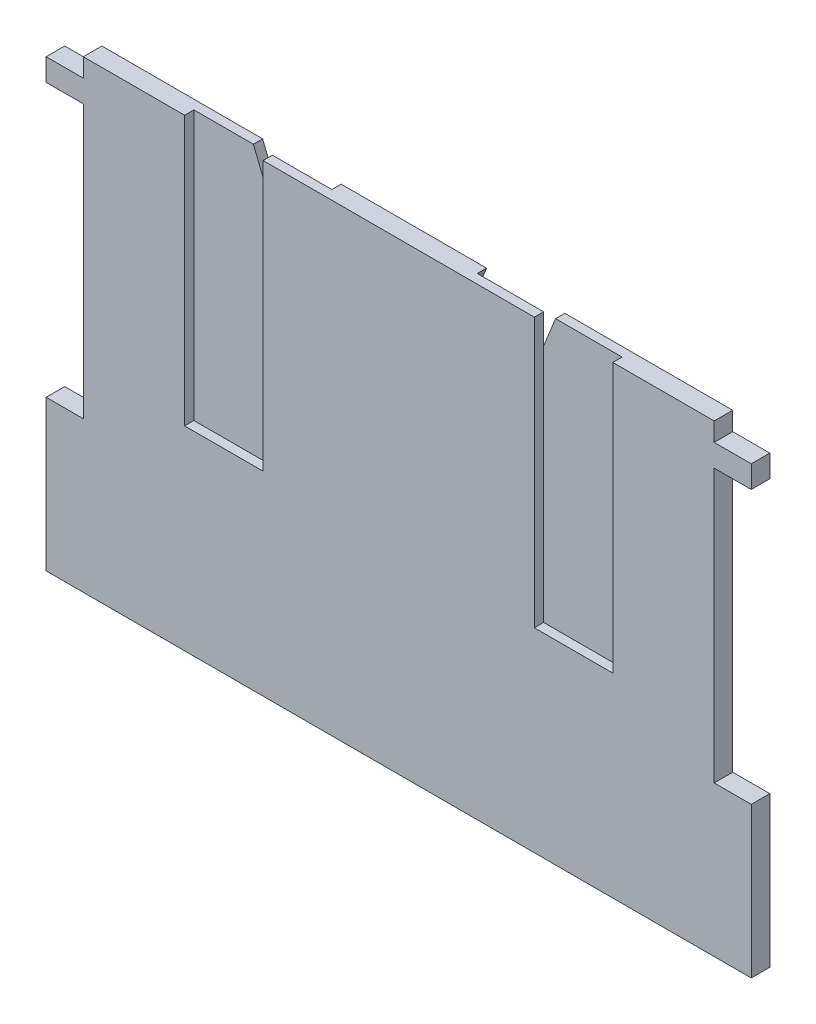
ISO-10303-21;
HEADER;
FILE_DESCRIPTION(('STEP AP214'),'2;1');
FILE_NAME('part.step','',(''),(''),'','','');
FILE_SCHEMA(('AUTOMOTIVE_DESIGN { 1 0 10303 214 1 1 1 1 }'));
ENDSEC;
DATA;
#1=APPLICATION_CONTEXT('core data for automotive mechanical design processes');
#2=APPLICATION_PROTOCOL_DEFINITION('international standard','automotive_design',2000,#1);
#3=PRODUCT_CONTEXT('',#1,'mechanical');
#4=PRODUCT('Part','Part','',(#3));
#5=PRODUCT_RELATED_PRODUCT_CATEGORY('part','',(#4));
#6=PRODUCT_DEFINITION_FORMATION('','',#4);
#7=PRODUCT_DEFINITION_CONTEXT('part definition',#1,'design');
#8=PRODUCT_DEFINITION('design','',#6,#7);
#9=PRODUCT_DEFINITION_SHAPE('','',#8);
#10=(LENGTH_UNIT() NAMED_UNIT(*) SI_UNIT(.MILLI.,.METRE.));
#11=(NAMED_UNIT(*) PLANE_ANGLE_UNIT() SI_UNIT($,.RADIAN.));
#12=(NAMED_UNIT(*) SI_UNIT($,.STERADIAN.) SOLID_ANGLE_UNIT());
#13=UNCERTAINTY_MEASURE_WITH_UNIT(LENGTH_MEASURE(1.E-05),#10,'distance_accuracy_value','');
#14=(GEOMETRIC_REPRESENTATION_CONTEXT(3) GLOBAL_UNCERTAINTY_ASSIGNED_CONTEXT((#13)) GLOBAL_UNIT_ASSIGNED_CONTEXT((#10,
#11,#12)) REPRESENTATION_CONTEXT('',''));
#15=CARTESIAN_POINT('',(0.,0.,0.));
#16=DIRECTION('',(0.,0.,1.));
#17=DIRECTION('',(1.,0.,0.));
#18=AXIS2_PLACEMENT_3D('',#15,#16,#17);
#19=CARTESIAN_POINT('',(-17.,-0.5,1.));
#20=DIRECTION('',(0.,-1.,0.));
#21=DIRECTION('',(0.,0.,-1.));
#22=AXIS2_PLACEMENT_3D('',#19,#20,#21);
#23=PLANE('',#22);
#24=DIRECTION('',(0.,0.,-1.));
#25=VECTOR('',#24,1.);
#26=CARTESIAN_POINT('',(-7.30769230769334,-0.5,1.));
#27=LINE('',#26,#25);
#28=CARTESIAN_POINT('',(-7.30769230769334,-0.5,1.));
#29=VERTEX_POINT('',#28);
#30=CARTESIAN_POINT('',(-7.30769230769334,-0.5,0.5));
#31=VERTEX_POINT('',#30);
#32=EDGE_CURVE('E283',#29,#31,#27,.T.);
#33=ORIENTED_EDGE('',*,*,#32,.F.);
#34=DIRECTION('',(-1.,0.,0.));
#35=VECTOR('',#34,1.);
#36=CARTESIAN_POINT('',(-17.,-0.5,1.));
#37=LINE('',#36,#35);
#38=CARTESIAN_POINT('',(7.30769230769127,-0.5,1.));
#39=VERTEX_POINT('',#38);
#40=EDGE_CURVE('E487',#39,#29,#37,.T.);
#41=ORIENTED_EDGE('',*,*,#40,.F.);
#42=DIRECTION('',(0.,0.,1.));
#43=VECTOR('',#42,1.);
#44=CARTESIAN_POINT('',(7.30769230769127,-0.5,1.));
#45=LINE('',#44,#43);
#46=CARTESIAN_POINT('',(7.30769230769127,-0.5,0.5));
#47=VERTEX_POINT('',#46);
#48=EDGE_CURVE('E285',#47,#39,#45,.T.);
#49=ORIENTED_EDGE('',*,*,#48,.F.);
#50=DIRECTION('',(1.,0.,0.));
#51=VECTOR('',#50,1.);
#52=CARTESIAN_POINT('',(-17.,-0.5,0.5));
#53=LINE('',#52,#51);
#54=CARTESIAN_POINT('',(3.73248914305372,-0.500000000000001,0.5));
#55=VERTEX_POINT('',#54);
#56=EDGE_CURVE('E491',#55,#47,#53,.T.);
#57=ORIENTED_EDGE('',*,*,#56,.F.);
#58=DIRECTION('',(0.,0.,1.));
#59=VECTOR('',#58,1.);
#60=CARTESIAN_POINT('',(3.73248914305372,-0.5,1.));
#61=LINE('',#60,#59);
#62=CARTESIAN_POINT('',(3.73248914305372,-0.500000000000001,0.));
#63=VERTEX_POINT('',#62);
#64=EDGE_CURVE('E492',#63,#55,#61,.T.);
#65=ORIENTED_EDGE('',*,*,#64,.F.);
#66=DIRECTION('',(1.,0.,0.));
#67=VECTOR('',#66,1.);
#68=CARTESIAN_POINT('',(-17.,-0.5,0.));
#69=LINE('',#68,#67);
#70=CARTESIAN_POINT('',(-4.10410844046952,-0.500000000000001,0.));
#71=VERTEX_POINT('',#70);
#72=EDGE_CURVE('E558',#63,#71,#69,.F.);
#73=ORIENTED_EDGE('',*,*,#72,.T.);
#74=DIRECTION('',(0.,0.,-1.));
#75=VECTOR('',#74,1.);
#76=CARTESIAN_POINT('',(-4.10410844046952,-0.5,1.));
#77=LINE('',#76,#75);
#78=CARTESIAN_POINT('',(-4.10410844046952,-0.5,0.5));
#79=VERTEX_POINT('',#78);
#80=EDGE_CURVE('E547',#79,#71,#77,.T.);
#81=ORIENTED_EDGE('',*,*,#80,.F.);
#82=EDGE_CURVE('E496',#31,#79,#53,.T.);
#83=ORIENTED_EDGE('',*,*,#82,.F.);
#84=EDGE_LOOP('',(#33,#41,#49,#57,#65,#73,#81,#83));
#85=FACE_BOUND('',#84,.T.);
#86=ADVANCED_FACE('F39',(#85),#23,.F.);
#87=DIRECTION('',(0.,0.,-1.));
#88=VECTOR('',#87,1.);
#89=CARTESIAN_POINT('',(11.5384615384605,-0.5,1.));
#90=LINE('',#89,#88);
#91=CARTESIAN_POINT('',(11.5384615384605,-0.5,1.));
#92=VERTEX_POINT('',#91);
#93=CARTESIAN_POINT('',(11.5384615384605,-0.5,0.5));
#94=VERTEX_POINT('',#93);
#95=EDGE_CURVE('E11',#92,#94,#90,.T.);
#96=ORIENTED_EDGE('',*,*,#95,.F.);
#97=CARTESIAN_POINT('',(17.,-0.5,1.));
#98=VERTEX_POINT('',#97);
#99=EDGE_CURVE('E488',#98,#92,#37,.T.);
#100=ORIENTED_EDGE('',*,*,#99,.F.);
#101=DIRECTION('',(0.,0.,-1.));
#102=VECTOR('',#101,1.);
#103=CARTESIAN_POINT('',(17.,-0.5,1.));
#104=LINE('',#103,#102);
#105=CARTESIAN_POINT('',(17.,-0.5,0.));
#106=VERTEX_POINT('',#105);
#107=EDGE_CURVE('E460',#98,#106,#104,.T.);
#108=ORIENTED_EDGE('',*,*,#107,.T.);
#109=DIRECTION('',(1.,0.,0.));
#110=VECTOR('',#109,1.);
#111=CARTESIAN_POINT('',(-17.,-0.5,0.));
#112=LINE('',#111,#110);
#113=CARTESIAN_POINT('',(7.95042067307694,-0.500000000000002,0.));
#114=VERTEX_POINT('',#113);
#115=EDGE_CURVE('E544',#106,#114,#112,.F.);
#116=ORIENTED_EDGE('',*,*,#115,.T.);
#117=DIRECTION('',(0.,0.,-1.));
#118=VECTOR('',#117,1.);
#119=CARTESIAN_POINT('',(7.95042067307694,-0.5,1.));
#120=LINE('',#119,#118);
#121=CARTESIAN_POINT('',(7.95042067307694,-0.5,0.500000000000537));
#122=VERTEX_POINT('',#121);
#123=EDGE_CURVE('E550',#122,#114,#120,.T.);
#124=ORIENTED_EDGE('',*,*,#123,.F.);
#125=DIRECTION('',(-1.,0.,0.));
#126=VECTOR('',#125,1.);
#127=CARTESIAN_POINT('',(-17.,-0.5,0.49999999999977));
#128=LINE('',#127,#126);
#129=EDGE_CURVE('E294',#94,#122,#128,.T.);
#130=ORIENTED_EDGE('',*,*,#129,.F.);
#131=EDGE_LOOP('',(#96,#100,#108,#116,#124,#130));
#132=FACE_BOUND('',#131,.T.);
#133=ADVANCED_FACE('F344',(#132),#23,.F.);
#134=DIRECTION('',(0.,0.,1.));
#135=VECTOR('',#134,1.);
#136=CARTESIAN_POINT('',(-11.5384615384626,-0.5,1.));
#137=LINE('',#136,#135);
#138=CARTESIAN_POINT('',(-11.5384615384626,-0.5,0.5));
#139=VERTEX_POINT('',#138);
#140=CARTESIAN_POINT('',(-11.5384615384626,-0.5,1.));
#141=VERTEX_POINT('',#140);
#142=EDGE_CURVE('E50',#139,#141,#137,.T.);
#143=ORIENTED_EDGE('',*,*,#142,.F.);
#144=CARTESIAN_POINT('',(-8.33193108974358,-0.5,0.500000000000036));
#145=VERTEX_POINT('',#144);
#146=EDGE_CURVE('E295',#145,#139,#128,.T.);
#147=ORIENTED_EDGE('',*,*,#146,.F.);
#148=DIRECTION('',(0.,0.,1.));
#149=VECTOR('',#148,1.);
#150=CARTESIAN_POINT('',(-8.33193108974357,-0.5,1.));
#151=LINE('',#150,#149);
#152=CARTESIAN_POINT('',(-8.33193108974358,-0.5,0.));
#153=VERTEX_POINT('',#152);
#154=EDGE_CURVE('E549',#153,#145,#151,.T.);
#155=ORIENTED_EDGE('',*,*,#154,.F.);
#156=DIRECTION('',(1.,0.,0.));
#157=VECTOR('',#156,1.);
#158=CARTESIAN_POINT('',(-17.,-0.5,0.));
#159=LINE('',#158,#157);
#160=CARTESIAN_POINT('',(-17.,-0.5,0.));
#161=VERTEX_POINT('',#160);
#162=EDGE_CURVE('E565',#153,#161,#159,.F.);
#163=ORIENTED_EDGE('',*,*,#162,.T.);
#164=DIRECTION('',(0.,0.,-1.));
#165=VECTOR('',#164,1.);
#166=CARTESIAN_POINT('',(-17.,-0.5,1.));
#167=LINE('',#166,#165);
#168=CARTESIAN_POINT('',(-17.,-0.5,1.));
#169=VERTEX_POINT('',#168);
#170=EDGE_CURVE('E453',#169,#161,#167,.T.);
#171=ORIENTED_EDGE('',*,*,#170,.F.);
#172=EDGE_CURVE('E484',#141,#169,#37,.T.);
#173=ORIENTED_EDGE('',*,*,#172,.F.);
#174=EDGE_LOOP('',(#143,#147,#155,#163,#171,#173));
#175=FACE_BOUND('',#174,.T.);
#176=ADVANCED_FACE('F341',(#175),#23,.F.);
#177=CARTESIAN_POINT('',(0.,0.,0.));
#178=DIRECTION('',(0.,0.,-1.));
#179=DIRECTION('',(-1.,0.,0.));
#180=AXIS2_PLACEMENT_3D('',#177,#178,#179);
#181=PLANE('',#180);
#182=CARTESIAN_POINT('',(-0.192307692307676,-11.3461538461538,0.));
#183=CARTESIAN_POINT('',(-0.436283159266334,-10.536029734166,0.));
#184=CARTESIAN_POINT('',(-0.927732110776665,-8.90416629153097,0.));
#185=CARTESIAN_POINT('',(-1.52177692105446,-7.30678126442586,0.));
#186=CARTESIAN_POINT('',(-1.82091346153845,-6.50240384615385,0.));
#187=B_SPLINE_CURVE_WITH_KNOTS('',3,(#182,#183,#184,#185,#186),.UNSPECIFIED.,.F.,.F.,(4,1,4),
(0.,0.496441118062961,1.),.UNSPECIFIED.);
#188=CARTESIAN_POINT('',(-0.192307692307676,-11.3461538461538,0.));
#189=VERTEX_POINT('',#188);
#190=CARTESIAN_POINT('',(-1.82091346153845,-6.50240384615385,0.));
#191=VERTEX_POINT('',#190);
#192=EDGE_CURVE('E416',#189,#191,#187,.T.);
#193=ORIENTED_EDGE('',*,*,#192,.T.);
#194=DIRECTION('',(-0.355528180527443,0.934665562033204,0.));
#195=VECTOR('',#194,1.);
#196=CARTESIAN_POINT('',(-1.82091346153845,-6.50240384615385,0.));
#197=LINE('',#196,#195);
#198=EDGE_CURVE('E296',#191,#71,#197,.T.);
#199=ORIENTED_EDGE('',*,*,#198,.T.);
#200=ORIENTED_EDGE('',*,*,#72,.F.);
#201=DIRECTION('',(-0.354843274387437,-0.934925799527429,0.));
#202=VECTOR('',#201,1.);
#203=CARTESIAN_POINT('',(9.61538461538463,15.,0.));
#204=LINE('',#203,#202);
#205=CARTESIAN_POINT('',(1.45432692307694,-6.50240384615385,0.));
#206=VERTEX_POINT('',#205);
#207=EDGE_CURVE('E543',#63,#206,#204,.T.);
#208=ORIENTED_EDGE('',*,*,#207,.T.);
#209=CARTESIAN_POINT('',(1.45432692307694,-6.50240384615385,0.));
#210=CARTESIAN_POINT('',(1.29462311342916,-6.92654798970864,0.));
#211=CARTESIAN_POINT('',(0.982209524710737,-7.75626140928266,0.));
#212=CARTESIAN_POINT('',(0.546548526776855,-8.98749923828078,0.));
#213=CARTESIAN_POINT('',(0.157093822225146,-10.178168976816,0.));
#214=CARTESIAN_POINT('',(-0.0777034874446245,-10.9630531105388,0.));
#215=CARTESIAN_POINT('',(-0.192307692307676,-11.3461538461538,0.));
#216=B_SPLINE_CURVE_WITH_KNOTS('',3,(#209,#210,#211,#212,#213,#214,#215),.UNSPECIFIED.,.F.,.F.,
(4,1,1,1,4),(0.,0.265686788941875,0.519738153970579,0.765584933372219,1.),.UNSPECIFIED.);
#217=EDGE_CURVE('E421',#206,#189,#216,.T.);
#218=ORIENTED_EDGE('',*,*,#217,.T.);
#219=EDGE_LOOP('',(#193,#199,#200,#208,#218));
#220=FACE_BOUND('',#219,.T.);
#221=ADVANCED_FACE('F404',(#220),#181,.T.);
#222=ORIENTED_EDGE('',*,*,#162,.F.);
#223=DIRECTION('',(0.37414358328157,-0.927370788352332,0.));
#224=VECTOR('',#223,1.);
#225=CARTESIAN_POINT('',(-14.5853365384615,15.,0.));
#226=LINE('',#225,#224);
#227=CARTESIAN_POINT('',(-2.48197115384614,-15.,0.));
#228=VERTEX_POINT('',#227);
#229=EDGE_CURVE('E494',#153,#228,#226,.T.);
#230=ORIENTED_EDGE('',*,*,#229,.T.);
#231=DIRECTION('',(1.,0.,0.));
#232=VECTOR('',#231,1.);
#233=CARTESIAN_POINT('',(-2.48197115384614,-15.,0.));
#234=LINE('',#233,#232);
#235=CARTESIAN_POINT('',(2.1033653846154,-15.,0.));
#236=VERTEX_POINT('',#235);
#237=EDGE_CURVE('E556',#228,#236,#234,.T.);
#238=ORIENTED_EDGE('',*,*,#237,.T.);
#239=DIRECTION('',(0.37398380014855,0.927435236135898,0.));
#240=VECTOR('',#239,1.);
#241=CARTESIAN_POINT('',(2.1033653846154,-15.,0.));
#242=LINE('',#241,#240);
#243=EDGE_CURVE('E428',#236,#114,#242,.T.);
#244=ORIENTED_EDGE('',*,*,#243,.T.);
#245=ORIENTED_EDGE('',*,*,#115,.F.);
#246=DIRECTION('',(0.,1.,0.));
#247=VECTOR('',#246,1.);
#248=CARTESIAN_POINT('',(17.,-0.5,0.));
#249=LINE('',#248,#247);
#250=CARTESIAN_POINT('',(17.,-1.5,0.));
#251=VERTEX_POINT('',#250);
#252=EDGE_CURVE('E489',#251,#106,#249,.T.);
#253=ORIENTED_EDGE('',*,*,#252,.F.);
#254=DIRECTION('',(1.,0.,0.));
#255=VECTOR('',#254,1.);
#256=CARTESIAN_POINT('',(17.,-1.5,0.));
#257=LINE('',#256,#255);
#258=CARTESIAN_POINT('',(19.,-1.5,0.));
#259=VERTEX_POINT('',#258);
#260=EDGE_CURVE('E570',#259,#251,#257,.F.);
#261=ORIENTED_EDGE('',*,*,#260,.F.);
#262=DIRECTION('',(0.,1.,0.));
#263=VECTOR('',#262,1.);
#264=CARTESIAN_POINT('',(19.,-1.5,0.));
#265=LINE('',#264,#263);
#266=CARTESIAN_POINT('',(19.,-2.7,0.));
#267=VERTEX_POINT('',#266);
#268=EDGE_CURVE('E568',#267,#259,#265,.T.);
#269=ORIENTED_EDGE('',*,*,#268,.F.);
#270=DIRECTION('',(1.,0.,0.));
#271=VECTOR('',#270,1.);
#272=CARTESIAN_POINT('',(19.,-2.7,0.));
#273=LINE('',#272,#271);
#274=CARTESIAN_POINT('',(17.,-2.7,0.));
#275=VERTEX_POINT('',#274);
#276=EDGE_CURVE('E572',#275,#267,#273,.T.);
#277=ORIENTED_EDGE('',*,*,#276,.F.);
#278=DIRECTION('',(0.,1.,0.));
#279=VECTOR('',#278,1.);
#280=CARTESIAN_POINT('',(17.,-2.7,0.));
#281=LINE('',#280,#279);
#282=CARTESIAN_POINT('',(17.,-17.3947217067352,0.));
#283=VERTEX_POINT('',#282);
#284=EDGE_CURVE('E575',#283,#275,#281,.T.);
#285=ORIENTED_EDGE('',*,*,#284,.F.);
#286=DIRECTION('',(1.,0.,0.));
#287=VECTOR('',#286,1.);
#288=CARTESIAN_POINT('',(17.,-17.3947217067352,0.));
#289=LINE('',#288,#287);
#290=CARTESIAN_POINT('',(19.,-17.3947217067352,0.));
#291=VERTEX_POINT('',#290);
#292=EDGE_CURVE('E578',#291,#283,#289,.F.);
#293=ORIENTED_EDGE('',*,*,#292,.F.);
#294=DIRECTION('',(0.,1.,0.));
#295=VECTOR('',#294,1.);
#296=CARTESIAN_POINT('',(19.,-17.3947217067352,0.));
#297=LINE('',#296,#295);
#298=CARTESIAN_POINT('',(19.,-25.5,0.));
#299=VERTEX_POINT('',#298);
#300=EDGE_CURVE('E576',#299,#291,#297,.T.);
#301=ORIENTED_EDGE('',*,*,#300,.F.);
#302=DIRECTION('',(1.,0.,0.));
#303=VECTOR('',#302,1.);
#304=CARTESIAN_POINT('',(19.,-25.5,0.));
#305=LINE('',#304,#303);
#306=CARTESIAN_POINT('',(-19.,-25.5,0.));
#307=VERTEX_POINT('',#306);
#308=EDGE_CURVE('E577',#307,#299,#305,.T.);
#309=ORIENTED_EDGE('',*,*,#308,.F.);
#310=DIRECTION('',(0.,1.,0.));
#311=VECTOR('',#310,1.);
#312=CARTESIAN_POINT('',(-19.,-25.5,0.));
#313=LINE('',#312,#311);
#314=CARTESIAN_POINT('',(-19.,-17.3947217067352,0.));
#315=VERTEX_POINT('',#314);
#316=EDGE_CURVE('E585',#315,#307,#313,.F.);
#317=ORIENTED_EDGE('',*,*,#316,.F.);
#318=DIRECTION('',(1.,0.,0.));
#319=VECTOR('',#318,1.);
#320=CARTESIAN_POINT('',(-19.,-17.3947217067352,0.));
#321=LINE('',#320,#319);
#322=CARTESIAN_POINT('',(-17.,-17.3947217067352,0.));
#323=VERTEX_POINT('',#322);
#324=EDGE_CURVE('E582',#323,#315,#321,.F.);
#325=ORIENTED_EDGE('',*,*,#324,.F.);
#326=DIRECTION('',(0.,1.,0.));
#327=VECTOR('',#326,1.);
#328=CARTESIAN_POINT('',(-17.,-17.3947217067352,0.));
#329=LINE('',#328,#327);
#330=CARTESIAN_POINT('',(-17.,-2.7,0.));
#331=VERTEX_POINT('',#330);
#332=EDGE_CURVE('E586',#331,#323,#329,.F.);
#333=ORIENTED_EDGE('',*,*,#332,.F.);
#334=DIRECTION('',(1.,0.,0.));
#335=VECTOR('',#334,1.);
#336=CARTESIAN_POINT('',(-17.,-2.7,0.));
#337=LINE('',#336,#335);
#338=CARTESIAN_POINT('',(-19.,-2.7,0.));
#339=VERTEX_POINT('',#338);
#340=EDGE_CURVE('E588',#339,#331,#337,.T.);
#341=ORIENTED_EDGE('',*,*,#340,.F.);
#342=DIRECTION('',(0.,1.,0.));
#343=VECTOR('',#342,1.);
#344=CARTESIAN_POINT('',(-19.,-2.7,0.));
#345=LINE('',#344,#343);
#346=CARTESIAN_POINT('',(-19.,-1.5,0.));
#347=VERTEX_POINT('',#346);
#348=EDGE_CURVE('E589',#347,#339,#345,.F.);
#349=ORIENTED_EDGE('',*,*,#348,.F.);
#350=DIRECTION('',(1.,0.,0.));
#351=VECTOR('',#350,1.);
#352=CARTESIAN_POINT('',(-19.,-1.5,0.));
#353=LINE('',#352,#351);
#354=CARTESIAN_POINT('',(-17.,-1.5,0.));
#355=VERTEX_POINT('',#354);
#356=EDGE_CURVE('E595',#355,#347,#353,.F.);
#357=ORIENTED_EDGE('',*,*,#356,.F.);
#358=DIRECTION('',(0.,1.,0.));
#359=VECTOR('',#358,1.);
#360=CARTESIAN_POINT('',(-17.,-1.5,0.));
#361=LINE('',#360,#359);
#362=EDGE_CURVE('E567',#161,#355,#361,.F.);
#363=ORIENTED_EDGE('',*,*,#362,.F.);
#364=EDGE_LOOP('',(#222,#230,#238,#244,#245,#253,#261,#269,#277,#285,#293,#301,#309,#317,#325,
#333,#341,#349,#357,#363));
#365=FACE_BOUND('',#364,.T.);
#366=ADVANCED_FACE('F350',(#365),#181,.T.);
#367=CARTESIAN_POINT('',(-17.,-1.5,1.));
#368=DIRECTION('',(1.,0.,0.));
#369=DIRECTION('',(0.,0.,-1.));
#370=AXIS2_PLACEMENT_3D('',#367,#368,#369);
#371=PLANE('',#370);
#372=ORIENTED_EDGE('',*,*,#362,.T.);
#373=DIRECTION('',(0.,0.,-1.));
#374=VECTOR('',#373,1.);
#375=CARTESIAN_POINT('',(-17.,-1.5,1.));
#376=LINE('',#375,#374);
#377=CARTESIAN_POINT('',(-17.,-1.5,1.));
#378=VERTEX_POINT('',#377);
#379=EDGE_CURVE('E497',#378,#355,#376,.T.);
#380=ORIENTED_EDGE('',*,*,#379,.F.);
#381=DIRECTION('',(0.,-1.,0.));
#382=VECTOR('',#381,1.);
#383=CARTESIAN_POINT('',(-17.,-1.5,1.));
#384=LINE('',#383,#382);
#385=EDGE_CURVE('E481',#169,#378,#384,.T.);
#386=ORIENTED_EDGE('',*,*,#385,.F.);
#387=ORIENTED_EDGE('',*,*,#170,.T.);
#388=EDGE_LOOP('',(#372,#380,#386,#387));
#389=FACE_BOUND('',#388,.T.);
#390=ADVANCED_FACE('F343',(#389),#371,.F.);
#391=CARTESIAN_POINT('',(-19.,-1.5,1.));
#392=DIRECTION('',(0.,-1.,0.));
#393=DIRECTION('',(1.,0.,0.));
#394=AXIS2_PLACEMENT_3D('',#391,#392,#393);
#395=PLANE('',#394);
#396=ORIENTED_EDGE('',*,*,#356,.T.);
#397=DIRECTION('',(0.,0.,-1.));
#398=VECTOR('',#397,1.);
#399=CARTESIAN_POINT('',(-19.,-1.5,1.));
#400=LINE('',#399,#398);
#401=CARTESIAN_POINT('',(-19.,-1.5,1.));
#402=VERTEX_POINT('',#401);
#403=EDGE_CURVE('E505',#402,#347,#400,.T.);
#404=ORIENTED_EDGE('',*,*,#403,.F.);
#405=DIRECTION('',(-1.,0.,0.));
#406=VECTOR('',#405,1.);
#407=CARTESIAN_POINT('',(-19.,-1.5,1.));
#408=LINE('',#407,#406);
#409=EDGE_CURVE('E483',#378,#402,#408,.T.);
#410=ORIENTED_EDGE('',*,*,#409,.F.);
#411=ORIENTED_EDGE('',*,*,#379,.T.);
#412=EDGE_LOOP('',(#396,#404,#410,#411));
#413=FACE_BOUND('',#412,.T.);
#414=ADVANCED_FACE('F346',(#413),#395,.F.);
#415=CARTESIAN_POINT('',(-19.,-2.7,1.));
#416=DIRECTION('',(1.,0.,0.));
#417=DIRECTION('',(0.,0.,-1.));
#418=AXIS2_PLACEMENT_3D('',#415,#416,#417);
#419=PLANE('',#418);
#420=ORIENTED_EDGE('',*,*,#348,.T.);
#421=DIRECTION('',(0.,0.,-1.));
#422=VECTOR('',#421,1.);
#423=CARTESIAN_POINT('',(-19.,-2.7,1.));
#424=LINE('',#423,#422);
#425=CARTESIAN_POINT('',(-19.,-2.7,1.));
#426=VERTEX_POINT('',#425);
#427=EDGE_CURVE('E504',#426,#339,#424,.T.);
#428=ORIENTED_EDGE('',*,*,#427,.F.);
#429=DIRECTION('',(0.,-1.,0.));
#430=VECTOR('',#429,1.);
#431=CARTESIAN_POINT('',(-19.,-2.7,1.));
#432=LINE('',#431,#430);
#433=EDGE_CURVE('E476',#402,#426,#432,.T.);
#434=ORIENTED_EDGE('',*,*,#433,.F.);
#435=ORIENTED_EDGE('',*,*,#403,.T.);
#436=EDGE_LOOP('',(#420,#428,#434,#435));
#437=FACE_BOUND('',#436,.T.);
#438=ADVANCED_FACE('F351',(#437),#419,.F.);
#439=CARTESIAN_POINT('',(-17.,-2.7,1.));
#440=DIRECTION('',(0.,1.,0.));
#441=DIRECTION('',(0.,0.,1.));
#442=AXIS2_PLACEMENT_3D('',#439,#440,#441);
#443=PLANE('',#442);
#444=ORIENTED_EDGE('',*,*,#340,.T.);
#445=DIRECTION('',(0.,0.,-1.));
#446=VECTOR('',#445,1.);
#447=CARTESIAN_POINT('',(-17.,-2.7,1.));
#448=LINE('',#447,#446);
#449=CARTESIAN_POINT('',(-17.,-2.7,1.));
#450=VERTEX_POINT('',#449);
#451=EDGE_CURVE('E509',#450,#331,#448,.T.);
#452=ORIENTED_EDGE('',*,*,#451,.F.);
#453=DIRECTION('',(1.,0.,0.));
#454=VECTOR('',#453,1.);
#455=CARTESIAN_POINT('',(-17.,-2.7,1.));
#456=LINE('',#455,#454);
#457=EDGE_CURVE('E479',#426,#450,#456,.T.);
#458=ORIENTED_EDGE('',*,*,#457,.F.);
#459=ORIENTED_EDGE('',*,*,#427,.T.);
#460=EDGE_LOOP('',(#444,#452,#458,#459));
#461=FACE_BOUND('',#460,.T.);
#462=ADVANCED_FACE('F360',(#461),#443,.F.);
#463=CARTESIAN_POINT('',(-17.,-17.3947217067352,1.));
#464=DIRECTION('',(1.,0.,0.));
#465=DIRECTION('',(0.,0.,-1.));
#466=AXIS2_PLACEMENT_3D('',#463,#464,#465);
#467=PLANE('',#466);
#468=ORIENTED_EDGE('',*,*,#332,.T.);
#469=DIRECTION('',(0.,0.,-1.));
#470=VECTOR('',#469,1.);
#471=CARTESIAN_POINT('',(-17.,-17.3947217067352,1.));
#472=LINE('',#471,#470);
#473=CARTESIAN_POINT('',(-17.,-17.3947217067352,1.));
#474=VERTEX_POINT('',#473);
#475=EDGE_CURVE('E512',#474,#323,#472,.T.);
#476=ORIENTED_EDGE('',*,*,#475,.F.);
#477=DIRECTION('',(0.,-1.,0.));
#478=VECTOR('',#477,1.);
#479=CARTESIAN_POINT('',(-17.,-17.3947217067352,1.));
#480=LINE('',#479,#478);
#481=EDGE_CURVE('E473',#450,#474,#480,.T.);
#482=ORIENTED_EDGE('',*,*,#481,.F.);
#483=ORIENTED_EDGE('',*,*,#451,.T.);
#484=EDGE_LOOP('',(#468,#476,#482,#483));
#485=FACE_BOUND('',#484,.T.);
#486=ADVANCED_FACE('F361',(#485),#467,.F.);
#487=CARTESIAN_POINT('',(-19.,-17.3947217067352,1.));
#488=DIRECTION('',(0.,-1.,0.));
#489=DIRECTION('',(0.,0.,-1.));
#490=AXIS2_PLACEMENT_3D('',#487,#488,#489);
#491=PLANE('',#490);
#492=ORIENTED_EDGE('',*,*,#324,.T.);
#493=DIRECTION('',(0.,0.,-1.));
#494=VECTOR('',#493,1.);
#495=CARTESIAN_POINT('',(-19.,-17.3947217067352,1.));
#496=LINE('',#495,#494);
#497=CARTESIAN_POINT('',(-19.,-17.3947217067352,1.));
#498=VERTEX_POINT('',#497);
#499=EDGE_CURVE('E511',#498,#315,#496,.T.);
#500=ORIENTED_EDGE('',*,*,#499,.F.);
#501=DIRECTION('',(-1.,0.,0.));
#502=VECTOR('',#501,1.);
#503=CARTESIAN_POINT('',(-19.,-17.3947217067352,1.));
#504=LINE('',#503,#502);
#505=EDGE_CURVE('E471',#474,#498,#504,.T.);
#506=ORIENTED_EDGE('',*,*,#505,.F.);
#507=ORIENTED_EDGE('',*,*,#475,.T.);
#508=EDGE_LOOP('',(#492,#500,#506,#507));
#509=FACE_BOUND('',#508,.T.);
#510=ADVANCED_FACE('F364',(#509),#491,.F.);
#511=CARTESIAN_POINT('',(-19.,-25.5,1.));
#512=DIRECTION('',(1.,0.,0.));
#513=DIRECTION('',(0.,0.,-1.));
#514=AXIS2_PLACEMENT_3D('',#511,#512,#513);
#515=PLANE('',#514);
#516=ORIENTED_EDGE('',*,*,#316,.T.);
#517=DIRECTION('',(0.,0.,-1.));
#518=VECTOR('',#517,1.);
#519=CARTESIAN_POINT('',(-19.,-25.5,1.));
#520=LINE('',#519,#518);
#521=CARTESIAN_POINT('',(-19.,-25.5,1.));
#522=VERTEX_POINT('',#521);
#523=EDGE_CURVE('E520',#522,#307,#520,.T.);
#524=ORIENTED_EDGE('',*,*,#523,.F.);
#525=DIRECTION('',(0.,-1.,0.));
#526=VECTOR('',#525,1.);
#527=CARTESIAN_POINT('',(-19.,-25.5,1.));
#528=LINE('',#527,#526);
#529=EDGE_CURVE('E472',#498,#522,#528,.T.);
#530=ORIENTED_EDGE('',*,*,#529,.F.);
#531=ORIENTED_EDGE('',*,*,#499,.T.);
#532=EDGE_LOOP('',(#516,#524,#530,#531));
#533=FACE_BOUND('',#532,.T.);
#534=ADVANCED_FACE('F368',(#533),#515,.F.);
#535=CARTESIAN_POINT('',(19.,-25.5,1.));
#536=DIRECTION('',(0.,1.,0.));
#537=DIRECTION('',(0.,0.,1.));
#538=AXIS2_PLACEMENT_3D('',#535,#536,#537);
#539=PLANE('',#538);
#540=ORIENTED_EDGE('',*,*,#308,.T.);
#541=DIRECTION('',(0.,0.,-1.));
#542=VECTOR('',#541,1.);
#543=CARTESIAN_POINT('',(19.,-25.5,1.));
#544=LINE('',#543,#542);
#545=CARTESIAN_POINT('',(19.,-25.5,1.));
#546=VERTEX_POINT('',#545);
#547=EDGE_CURVE('E518',#546,#299,#544,.T.);
#548=ORIENTED_EDGE('',*,*,#547,.F.);
#549=DIRECTION('',(1.,0.,0.));
#550=VECTOR('',#549,1.);
#551=CARTESIAN_POINT('',(19.,-25.5,1.));
#552=LINE('',#551,#550);
#553=EDGE_CURVE('E466',#522,#546,#552,.T.);
#554=ORIENTED_EDGE('',*,*,#553,.F.);
#555=ORIENTED_EDGE('',*,*,#523,.T.);
#556=EDGE_LOOP('',(#540,#548,#554,#555));
#557=FACE_BOUND('',#556,.T.);
#558=ADVANCED_FACE('F374',(#557),#539,.F.);
#559=CARTESIAN_POINT('',(19.,-17.3947217067352,1.));
#560=DIRECTION('',(-1.,0.,0.));
#561=DIRECTION('',(0.,0.,1.));
#562=AXIS2_PLACEMENT_3D('',#559,#560,#561);
#563=PLANE('',#562);
#564=ORIENTED_EDGE('',*,*,#300,.T.);
#565=DIRECTION('',(0.,0.,-1.));
#566=VECTOR('',#565,1.);
#567=CARTESIAN_POINT('',(19.,-17.3947217067352,1.));
#568=LINE('',#567,#566);
#569=CARTESIAN_POINT('',(19.,-17.3947217067352,1.));
#570=VERTEX_POINT('',#569);
#571=EDGE_CURVE('E525',#570,#291,#568,.T.);
#572=ORIENTED_EDGE('',*,*,#571,.F.);
#573=DIRECTION('',(0.,1.,0.));
#574=VECTOR('',#573,1.);
#575=CARTESIAN_POINT('',(19.,-17.3947217067352,1.));
#576=LINE('',#575,#574);
#577=EDGE_CURVE('E469',#546,#570,#576,.T.);
#578=ORIENTED_EDGE('',*,*,#577,.F.);
#579=ORIENTED_EDGE('',*,*,#547,.T.);
#580=EDGE_LOOP('',(#564,#572,#578,#579));
#581=FACE_BOUND('',#580,.T.);
#582=ADVANCED_FACE('F379',(#581),#563,.F.);
#583=CARTESIAN_POINT('',(17.,-17.3947217067352,1.));
#584=DIRECTION('',(0.,-1.,0.));
#585=DIRECTION('',(0.,0.,-1.));
#586=AXIS2_PLACEMENT_3D('',#583,#584,#585);
#587=PLANE('',#586);
#588=ORIENTED_EDGE('',*,*,#292,.T.);
#589=DIRECTION('',(0.,0.,-1.));
#590=VECTOR('',#589,1.);
#591=CARTESIAN_POINT('',(17.,-17.3947217067352,1.));
#592=LINE('',#591,#590);
#593=CARTESIAN_POINT('',(17.,-17.3947217067352,1.));
#594=VERTEX_POINT('',#593);
#595=EDGE_CURVE('E528',#594,#283,#592,.T.);
#596=ORIENTED_EDGE('',*,*,#595,.F.);
#597=DIRECTION('',(-1.,0.,0.));
#598=VECTOR('',#597,1.);
#599=CARTESIAN_POINT('',(17.,-17.3947217067352,1.));
#600=LINE('',#599,#598);
#601=EDGE_CURVE('E463',#570,#594,#600,.T.);
#602=ORIENTED_EDGE('',*,*,#601,.F.);
#603=ORIENTED_EDGE('',*,*,#571,.T.);
#604=EDGE_LOOP('',(#588,#596,#602,#603));
#605=FACE_BOUND('',#604,.T.);
#606=ADVANCED_FACE('F382',(#605),#587,.F.);
#607=CARTESIAN_POINT('',(17.,-2.7,1.));
#608=DIRECTION('',(-1.,0.,0.));
#609=DIRECTION('',(0.,0.,1.));
#610=AXIS2_PLACEMENT_3D('',#607,#608,#609);
#611=PLANE('',#610);
#612=ORIENTED_EDGE('',*,*,#284,.T.);
#613=DIRECTION('',(0.,0.,-1.));
#614=VECTOR('',#613,1.);
#615=CARTESIAN_POINT('',(17.,-2.7,1.));
#616=LINE('',#615,#614);
#617=CARTESIAN_POINT('',(17.,-2.7,1.));
#618=VERTEX_POINT('',#617);
#619=EDGE_CURVE('E530',#618,#275,#616,.T.);
#620=ORIENTED_EDGE('',*,*,#619,.F.);
#621=DIRECTION('',(0.,1.,0.));
#622=VECTOR('',#621,1.);
#623=CARTESIAN_POINT('',(17.,-2.7,1.));
#624=LINE('',#623,#622);
#625=EDGE_CURVE('E464',#594,#618,#624,.T.);
#626=ORIENTED_EDGE('',*,*,#625,.F.);
#627=ORIENTED_EDGE('',*,*,#595,.T.);
#628=EDGE_LOOP('',(#612,#620,#626,#627));
#629=FACE_BOUND('',#628,.T.);
#630=ADVANCED_FACE('F383',(#629),#611,.F.);
#631=CARTESIAN_POINT('',(19.,-2.7,1.));
#632=DIRECTION('',(0.,1.,0.));
#633=DIRECTION('',(0.,0.,1.));
#634=AXIS2_PLACEMENT_3D('',#631,#632,#633);
#635=PLANE('',#634);
#636=ORIENTED_EDGE('',*,*,#276,.T.);
#637=DIRECTION('',(0.,0.,-1.));
#638=VECTOR('',#637,1.);
#639=CARTESIAN_POINT('',(19.,-2.7,1.));
#640=LINE('',#639,#638);
#641=CARTESIAN_POINT('',(19.,-2.7,1.));
#642=VERTEX_POINT('',#641);
#643=EDGE_CURVE('E535',#642,#267,#640,.T.);
#644=ORIENTED_EDGE('',*,*,#643,.F.);
#645=DIRECTION('',(1.,0.,0.));
#646=VECTOR('',#645,1.);
#647=CARTESIAN_POINT('',(19.,-2.7,1.));
#648=LINE('',#647,#646);
#649=EDGE_CURVE('E462',#618,#642,#648,.T.);
#650=ORIENTED_EDGE('',*,*,#649,.F.);
#651=ORIENTED_EDGE('',*,*,#619,.T.);
#652=EDGE_LOOP('',(#636,#644,#650,#651));
#653=FACE_BOUND('',#652,.T.);
#654=ADVANCED_FACE('F386',(#653),#635,.F.);
#655=CARTESIAN_POINT('',(19.,-1.5,1.));
#656=DIRECTION('',(-1.,0.,0.));
#657=DIRECTION('',(0.,0.,1.));
#658=AXIS2_PLACEMENT_3D('',#655,#656,#657);
#659=PLANE('',#658);
#660=ORIENTED_EDGE('',*,*,#268,.T.);
#661=DIRECTION('',(0.,0.,-1.));
#662=VECTOR('',#661,1.);
#663=CARTESIAN_POINT('',(19.,-1.5,1.));
#664=LINE('',#663,#662);
#665=CARTESIAN_POINT('',(19.,-1.5,1.));
#666=VERTEX_POINT('',#665);
#667=EDGE_CURVE('E532',#666,#259,#664,.T.);
#668=ORIENTED_EDGE('',*,*,#667,.F.);
#669=DIRECTION('',(0.,1.,0.));
#670=VECTOR('',#669,1.);
#671=CARTESIAN_POINT('',(19.,-1.5,1.));
#672=LINE('',#671,#670);
#673=EDGE_CURVE('E458',#642,#666,#672,.T.);
#674=ORIENTED_EDGE('',*,*,#673,.F.);
#675=ORIENTED_EDGE('',*,*,#643,.T.);
#676=EDGE_LOOP('',(#660,#668,#674,#675));
#677=FACE_BOUND('',#676,.T.);
#678=ADVANCED_FACE('F391',(#677),#659,.F.);
#679=CARTESIAN_POINT('',(17.,-1.5,1.));
#680=DIRECTION('',(0.,-1.,0.));
#681=DIRECTION('',(1.,0.,0.));
#682=AXIS2_PLACEMENT_3D('',#679,#680,#681);
#683=PLANE('',#682);
#684=ORIENTED_EDGE('',*,*,#260,.T.);
#685=DIRECTION('',(0.,0.,-1.));
#686=VECTOR('',#685,1.);
#687=CARTESIAN_POINT('',(17.,-1.5,1.));
#688=LINE('',#687,#686);
#689=CARTESIAN_POINT('',(17.,-1.5,1.));
#690=VERTEX_POINT('',#689);
#691=EDGE_CURVE('E538',#690,#251,#688,.T.);
#692=ORIENTED_EDGE('',*,*,#691,.F.);
#693=DIRECTION('',(-1.,0.,0.));
#694=VECTOR('',#693,1.);
#695=CARTESIAN_POINT('',(17.,-1.5,1.));
#696=LINE('',#695,#694);
#697=EDGE_CURVE('E456',#666,#690,#696,.T.);
#698=ORIENTED_EDGE('',*,*,#697,.F.);
#699=ORIENTED_EDGE('',*,*,#667,.T.);
#700=EDGE_LOOP('',(#684,#692,#698,#699));
#701=FACE_BOUND('',#700,.T.);
#702=ADVANCED_FACE('F400',(#701),#683,.F.);
#703=CARTESIAN_POINT('',(17.,-0.5,1.));
#704=DIRECTION('',(-1.,0.,0.));
#705=DIRECTION('',(0.,0.,1.));
#706=AXIS2_PLACEMENT_3D('',#703,#704,#705);
#707=PLANE('',#706);
#708=ORIENTED_EDGE('',*,*,#252,.T.);
#709=ORIENTED_EDGE('',*,*,#107,.F.);
#710=DIRECTION('',(0.,1.,0.));
#711=VECTOR('',#710,1.);
#712=CARTESIAN_POINT('',(17.,-0.5,1.));
#713=LINE('',#712,#711);
#714=EDGE_CURVE('E452',#690,#98,#713,.T.);
#715=ORIENTED_EDGE('',*,*,#714,.F.);
#716=ORIENTED_EDGE('',*,*,#691,.T.);
#717=EDGE_LOOP('',(#708,#709,#715,#716));
#718=FACE_BOUND('',#717,.T.);
#719=ADVANCED_FACE('F401',(#718),#707,.F.);
#720=CARTESIAN_POINT('',(0.,0.,1.));
#721=DIRECTION('',(0.,0.,-1.));
#722=DIRECTION('',(-1.,0.,0.));
#723=AXIS2_PLACEMENT_3D('',#720,#721,#722);
#724=PLANE('',#723);
#725=DIRECTION('',(-1.,0.,0.));
#726=VECTOR('',#725,1.);
#727=CARTESIAN_POINT('',(11.5384615384605,-15.,1.));
#728=LINE('',#727,#726);
#729=CARTESIAN_POINT('',(11.5384615384605,-15.,1.));
#730=VERTEX_POINT('',#729);
#731=CARTESIAN_POINT('',(7.30769230769127,-15.,1.));
#732=VERTEX_POINT('',#731);
#733=EDGE_CURVE('E605',#730,#732,#728,.T.);
#734=ORIENTED_EDGE('',*,*,#733,.T.);
#735=DIRECTION('',(0.,1.,0.));
#736=VECTOR('',#735,1.);
#737=CARTESIAN_POINT('',(7.30769230769127,-15.,1.));
#738=LINE('',#737,#736);
#739=EDGE_CURVE('E64',#732,#39,#738,.T.);
#740=ORIENTED_EDGE('',*,*,#739,.T.);
#741=ORIENTED_EDGE('',*,*,#40,.T.);
#742=DIRECTION('',(0.,-1.,0.));
#743=VECTOR('',#742,1.);
#744=CARTESIAN_POINT('',(-7.30769230769334,2.06129807692308,1.));
#745=LINE('',#744,#743);
#746=CARTESIAN_POINT('',(-7.30769230769334,-15.,1.));
#747=VERTEX_POINT('',#746);
#748=EDGE_CURVE('E688',#29,#747,#745,.T.);
#749=ORIENTED_EDGE('',*,*,#748,.T.);
#750=DIRECTION('',(-1.,0.,0.));
#751=VECTOR('',#750,1.);
#752=CARTESIAN_POINT('',(-7.30769230769334,-15.,1.));
#753=LINE('',#752,#751);
#754=CARTESIAN_POINT('',(-11.5384615384626,-15.,1.));
#755=VERTEX_POINT('',#754);
#756=EDGE_CURVE('E282',#747,#755,#753,.T.);
#757=ORIENTED_EDGE('',*,*,#756,.T.);
#758=DIRECTION('',(0.,1.,0.));
#759=VECTOR('',#758,1.);
#760=CARTESIAN_POINT('',(-11.5384615384626,-15.,1.));
#761=LINE('',#760,#759);
#762=EDGE_CURVE('E53',#755,#141,#761,.T.);
#763=ORIENTED_EDGE('',*,*,#762,.T.);
#764=ORIENTED_EDGE('',*,*,#172,.T.);
#765=ORIENTED_EDGE('',*,*,#385,.T.);
#766=ORIENTED_EDGE('',*,*,#409,.T.);
#767=ORIENTED_EDGE('',*,*,#433,.T.);
#768=ORIENTED_EDGE('',*,*,#457,.T.);
#769=ORIENTED_EDGE('',*,*,#481,.T.);
#770=ORIENTED_EDGE('',*,*,#505,.T.);
#771=ORIENTED_EDGE('',*,*,#529,.T.);
#772=ORIENTED_EDGE('',*,*,#553,.T.);
#773=ORIENTED_EDGE('',*,*,#577,.T.);
#774=ORIENTED_EDGE('',*,*,#601,.T.);
#775=ORIENTED_EDGE('',*,*,#625,.T.);
#776=ORIENTED_EDGE('',*,*,#649,.T.);
#777=ORIENTED_EDGE('',*,*,#673,.T.);
#778=ORIENTED_EDGE('',*,*,#697,.T.);
#779=ORIENTED_EDGE('',*,*,#714,.T.);
#780=ORIENTED_EDGE('',*,*,#99,.T.);
#781=DIRECTION('',(0.,-1.,0.));
#782=VECTOR('',#781,1.);
#783=CARTESIAN_POINT('',(11.5384615384605,2.25961538461539,1.));
#784=LINE('',#783,#782);
#785=EDGE_CURVE('E593',#92,#730,#784,.T.);
#786=ORIENTED_EDGE('',*,*,#785,.T.);
#787=EDGE_LOOP('',(#734,#740,#741,#749,#757,#763,#764,#765,#766,#767,#768,#769,#770,#771,#772,
#773,#774,#775,#776,#777,#778,#779,#780,#786));
#788=FACE_BOUND('',#787,.T.);
#789=ADVANCED_FACE('F41',(#788),#724,.F.);
#790=CARTESIAN_POINT('',(2.1033653846154,-15.,0.5));
#791=DIRECTION('',(-0.927435236135898,0.37398380014855,0.));
#792=DIRECTION('',(-0.37398380014855,-0.927435236135898,0.));
#793=AXIS2_PLACEMENT_3D('',#790,#791,#792);
#794=PLANE('',#793);
#795=ORIENTED_EDGE('',*,*,#123,.T.);
#796=ORIENTED_EDGE('',*,*,#243,.F.);
#797=DIRECTION('',(0.,0.,-1.));
#798=VECTOR('',#797,1.);
#799=CARTESIAN_POINT('',(2.1033653846154,-15.,0.5));
#800=LINE('',#799,#798);
#801=CARTESIAN_POINT('',(2.1033653846154,-15.,0.5));
#802=VERTEX_POINT('',#801);
#803=EDGE_CURVE('E449',#802,#236,#800,.T.);
#804=ORIENTED_EDGE('',*,*,#803,.F.);
#805=DIRECTION('',(0.37398380014855,0.927435236135898,0.));
#806=VECTOR('',#805,1.);
#807=CARTESIAN_POINT('',(2.1033653846154,-15.,0.5));
#808=LINE('',#807,#806);
#809=CARTESIAN_POINT('',(7.30769230769127,-2.09388971684315,0.5));
#810=VERTEX_POINT('',#809);
#811=EDGE_CURVE('E298',#802,#810,#808,.T.);
#812=ORIENTED_EDGE('',*,*,#811,.T.);
#813=EDGE_CURVE('E300',#810,#122,#808,.T.);
#814=ORIENTED_EDGE('',*,*,#813,.T.);
#815=EDGE_LOOP('',(#795,#796,#804,#812,#814));
#816=FACE_BOUND('',#815,.T.);
#817=ADVANCED_FACE('F332',(#816),#794,.T.);
#818=CARTESIAN_POINT('',(9.61538461538463,15.,0.5));
#819=DIRECTION('',(0.934925799527429,-0.354843274387437,0.));
#820=DIRECTION('',(0.354843274387437,0.934925799527429,0.));
#821=AXIS2_PLACEMENT_3D('',#818,#819,#820);
#822=PLANE('',#821);
#823=ORIENTED_EDGE('',*,*,#64,.T.);
#824=DIRECTION('',(-0.354843274387437,-0.934925799527429,0.));
#825=VECTOR('',#824,1.);
#826=CARTESIAN_POINT('',(9.61538461538463,15.,0.5));
#827=LINE('',#826,#825);
#828=CARTESIAN_POINT('',(1.45432692307694,-6.50240384615385,0.5));
#829=VERTEX_POINT('',#828);
#830=EDGE_CURVE('E301',#55,#829,#827,.T.);
#831=ORIENTED_EDGE('',*,*,#830,.T.);
#832=DIRECTION('',(0.,0.,-1.));
#833=VECTOR('',#832,1.);
#834=CARTESIAN_POINT('',(1.45432692307694,-6.50240384615385,0.5));
#835=LINE('',#834,#833);
#836=EDGE_CURVE('E448',#829,#206,#835,.T.);
#837=ORIENTED_EDGE('',*,*,#836,.T.);
#838=ORIENTED_EDGE('',*,*,#207,.F.);
#839=EDGE_LOOP('',(#823,#831,#837,#838));
#840=FACE_BOUND('',#839,.T.);
#841=ADVANCED_FACE('F330',(#840),#822,.T.);
#842=CARTESIAN_POINT('',(-1.82091346153845,-6.50240384615385,0.5));
#843=DIRECTION('',(-0.934665562033205,-0.355528180527443,0.));
#844=DIRECTION('',(0.355528180527443,-0.934665562033205,0.));
#845=AXIS2_PLACEMENT_3D('',#842,#843,#844);
#846=PLANE('',#845);
#847=ORIENTED_EDGE('',*,*,#80,.T.);
#848=ORIENTED_EDGE('',*,*,#198,.F.);
#849=DIRECTION('',(0.,0.,-1.));
#850=VECTOR('',#849,1.);
#851=CARTESIAN_POINT('',(-1.82091346153845,-6.50240384615385,0.5));
#852=LINE('',#851,#850);
#853=CARTESIAN_POINT('',(-1.82091346153845,-6.50240384615385,0.5));
#854=VERTEX_POINT('',#853);
#855=EDGE_CURVE('E441',#854,#191,#852,.T.);
#856=ORIENTED_EDGE('',*,*,#855,.F.);
#857=DIRECTION('',(-0.355528180527443,0.934665562033204,0.));
#858=VECTOR('',#857,1.);
#859=CARTESIAN_POINT('',(-1.82091346153845,-6.50240384615385,0.5));
#860=LINE('',#859,#858);
#861=EDGE_CURVE('E702',#854,#79,#860,.T.);
#862=ORIENTED_EDGE('',*,*,#861,.T.);
#863=EDGE_LOOP('',(#847,#848,#856,#862));
#864=FACE_BOUND('',#863,.T.);
#865=ADVANCED_FACE('F328',(#864),#846,.T.);
#866=CARTESIAN_POINT('',(-14.5853365384615,15.,0.5));
#867=DIRECTION('',(0.927370788352332,0.37414358328157,0.));
#868=DIRECTION('',(-0.37414358328157,0.927370788352333,0.));
#869=AXIS2_PLACEMENT_3D('',#866,#867,#868);
#870=PLANE('',#869);
#871=ORIENTED_EDGE('',*,*,#154,.T.);
#872=DIRECTION('',(0.37414358328157,-0.927370788352332,0.));
#873=VECTOR('',#872,1.);
#874=CARTESIAN_POINT('',(-14.5853365384615,15.,0.5));
#875=LINE('',#874,#873);
#876=CARTESIAN_POINT('',(-7.30769230769334,-3.0387288977134,0.5));
#877=VERTEX_POINT('',#876);
#878=EDGE_CURVE('E444',#145,#877,#875,.T.);
#879=ORIENTED_EDGE('',*,*,#878,.T.);
#880=CARTESIAN_POINT('',(-2.48197115384614,-15.,0.5));
#881=VERTEX_POINT('',#880);
#882=EDGE_CURVE('E693',#877,#881,#875,.T.);
#883=ORIENTED_EDGE('',*,*,#882,.T.);
#884=DIRECTION('',(0.,0.,-1.));
#885=VECTOR('',#884,1.);
#886=CARTESIAN_POINT('',(-2.48197115384614,-15.,0.5));
#887=LINE('',#886,#885);
#888=EDGE_CURVE('E436',#881,#228,#887,.T.);
#889=ORIENTED_EDGE('',*,*,#888,.T.);
#890=ORIENTED_EDGE('',*,*,#229,.F.);
#891=EDGE_LOOP('',(#871,#879,#883,#889,#890));
#892=FACE_BOUND('',#891,.T.);
#893=ADVANCED_FACE('F740',(#892),#870,.T.);
#894=CARTESIAN_POINT('',(0.579497032906944,-8.90680562357167,0.5));
#895=DIRECTION('',(0.,0.,-1.));
#896=DIRECTION('',(-1.,0.,0.));
#897=AXIS2_PLACEMENT_3D('',#894,#895,#896);
#898=PLANE('',#897);
#899=DIRECTION('',(0.,-1.,0.));
#900=VECTOR('',#899,1.);
#901=CARTESIAN_POINT('',(-7.30769230769334,2.06129807692308,0.5));
#902=LINE('',#901,#900);
#903=EDGE_CURVE('E268',#31,#877,#902,.T.);
#904=ORIENTED_EDGE('',*,*,#903,.F.);
#905=ORIENTED_EDGE('',*,*,#82,.T.);
#906=ORIENTED_EDGE('',*,*,#861,.F.);
#907=CARTESIAN_POINT('',(-0.192307692307676,-11.3461538461538,0.5));
#908=CARTESIAN_POINT('',(-0.436283159266334,-10.536029734166,0.5));
#909=CARTESIAN_POINT('',(-0.927732110776665,-8.90416629153097,0.5));
#910=CARTESIAN_POINT('',(-1.52177692105446,-7.30678126442586,0.5));
#911=CARTESIAN_POINT('',(-1.82091346153845,-6.50240384615385,0.5));
#912=B_SPLINE_CURVE_WITH_KNOTS('',3,(#907,#908,#909,#910,#911),.UNSPECIFIED.,.F.,.F.,(4,1,4),
(0.,0.496441118062961,1.),.UNSPECIFIED.);
#913=CARTESIAN_POINT('',(-0.192307692307676,-11.3461538461538,0.5));
#914=VERTEX_POINT('',#913);
#915=EDGE_CURVE('E307',#914,#854,#912,.T.);
#916=ORIENTED_EDGE('',*,*,#915,.F.);
#917=CARTESIAN_POINT('',(1.45432692307694,-6.50240384615385,0.5));
#918=CARTESIAN_POINT('',(1.29462311342916,-6.92654798970864,0.5));
#919=CARTESIAN_POINT('',(0.982209524710737,-7.75626140928266,0.5));
#920=CARTESIAN_POINT('',(0.546548526776855,-8.98749923828078,0.5));
#921=CARTESIAN_POINT('',(0.157093822225146,-10.178168976816,0.5));
#922=CARTESIAN_POINT('',(-0.0777034874446245,-10.9630531105388,0.5));
#923=CARTESIAN_POINT('',(-0.192307692307676,-11.3461538461538,0.5));
#924=B_SPLINE_CURVE_WITH_KNOTS('',3,(#917,#918,#919,#920,#921,#922,#923),.UNSPECIFIED.,.F.,.F.,
(4,1,1,1,4),(0.,0.265686788941875,0.519738153970579,0.765584933372219,1.),.UNSPECIFIED.);
#925=EDGE_CURVE('E304',#829,#914,#924,.T.);
#926=ORIENTED_EDGE('',*,*,#925,.F.);
#927=ORIENTED_EDGE('',*,*,#830,.F.);
#928=ORIENTED_EDGE('',*,*,#56,.T.);
#929=DIRECTION('',(0.,1.,0.));
#930=VECTOR('',#929,1.);
#931=CARTESIAN_POINT('',(7.30769230769127,-15.,0.5));
#932=LINE('',#931,#930);
#933=EDGE_CURVE('E548',#810,#47,#932,.T.);
#934=ORIENTED_EDGE('',*,*,#933,.F.);
#935=ORIENTED_EDGE('',*,*,#811,.F.);
#936=DIRECTION('',(1.,0.,0.));
#937=VECTOR('',#936,1.);
#938=CARTESIAN_POINT('',(-2.48197115384614,-15.,0.5));
#939=LINE('',#938,#937);
#940=EDGE_CURVE('E293',#881,#802,#939,.T.);
#941=ORIENTED_EDGE('',*,*,#940,.F.);
#942=ORIENTED_EDGE('',*,*,#882,.F.);
#943=EDGE_LOOP('',(#904,#905,#906,#916,#926,#927,#928,#934,#935,#941,#942));
#944=FACE_BOUND('',#943,.T.);
#945=ADVANCED_FACE('F336',(#944),#898,.T.);
#946=CARTESIAN_POINT('',(-2.48197115384614,-15.,0.5));
#947=DIRECTION('',(0.,1.,0.));
#948=DIRECTION('',(0.,0.,1.));
#949=AXIS2_PLACEMENT_3D('',#946,#947,#948);
#950=PLANE('',#949);
#951=ORIENTED_EDGE('',*,*,#237,.F.);
#952=ORIENTED_EDGE('',*,*,#888,.F.);
#953=ORIENTED_EDGE('',*,*,#940,.T.);
#954=ORIENTED_EDGE('',*,*,#803,.T.);
#955=EDGE_LOOP('',(#951,#952,#953,#954));
#956=FACE_BOUND('',#955,.T.);
#957=ADVANCED_FACE('F323',(#956),#950,.T.);
#958=DIRECTION('',(0.,0.,-1.));
#959=VECTOR('',#958,1.);
#960=SURFACE_OF_LINEAR_EXTRUSION('',#924,#959);
#961=ORIENTED_EDGE('',*,*,#217,.F.);
#962=ORIENTED_EDGE('',*,*,#836,.F.);
#963=ORIENTED_EDGE('',*,*,#925,.T.);
#964=DIRECTION('',(0.,0.,-1.));
#965=VECTOR('',#964,1.);
#966=CARTESIAN_POINT('',(-0.192307692307676,-11.3461538461538,0.5));
#967=LINE('',#966,#965);
#968=EDGE_CURVE('E446',#914,#189,#967,.T.);
#969=ORIENTED_EDGE('',*,*,#968,.T.);
#970=EDGE_LOOP('',(#961,#962,#963,#969));
#971=FACE_BOUND('',#970,.T.);
#972=ADVANCED_FACE('F317',(#971),#960,.T.);
#973=DIRECTION('',(0.,0.,-1.));
#974=VECTOR('',#973,1.);
#975=SURFACE_OF_LINEAR_EXTRUSION('',#912,#974);
#976=ORIENTED_EDGE('',*,*,#192,.F.);
#977=ORIENTED_EDGE('',*,*,#968,.F.);
#978=ORIENTED_EDGE('',*,*,#915,.T.);
#979=ORIENTED_EDGE('',*,*,#855,.T.);
#980=EDGE_LOOP('',(#976,#977,#978,#979));
#981=FACE_BOUND('',#980,.T.);
#982=ADVANCED_FACE('F322',(#981),#975,.T.);
#983=CARTESIAN_POINT('',(11.5384615384605,-15.,0.5));
#984=DIRECTION('',(0.,1.,0.));
#985=DIRECTION('',(0.,0.,1.));
#986=AXIS2_PLACEMENT_3D('',#983,#984,#985);
#987=PLANE('',#986);
#988=ORIENTED_EDGE('',*,*,#733,.F.);
#989=DIRECTION('',(0.,0.,1.));
#990=VECTOR('',#989,1.);
#991=CARTESIAN_POINT('',(11.5384615384605,-15.,0.5));
#992=LINE('',#991,#990);
#993=CARTESIAN_POINT('',(11.5384615384605,-15.,0.5));
#994=VERTEX_POINT('',#993);
#995=EDGE_CURVE('E289',#994,#730,#992,.T.);
#996=ORIENTED_EDGE('',*,*,#995,.F.);
#997=DIRECTION('',(-1.,0.,0.));
#998=VECTOR('',#997,1.);
#999=CARTESIAN_POINT('',(11.5384615384605,-15.,0.5));
#1000=LINE('',#999,#998);
#1001=CARTESIAN_POINT('',(7.30769230769127,-15.,0.5));
#1002=VERTEX_POINT('',#1001);
#1003=EDGE_CURVE('E682',#994,#1002,#1000,.T.);
#1004=ORIENTED_EDGE('',*,*,#1003,.T.);
#1005=DIRECTION('',(0.,0.,1.));
#1006=VECTOR('',#1005,1.);
#1007=CARTESIAN_POINT('',(7.30769230769127,-15.,0.5));
#1008=LINE('',#1007,#1006);
#1009=EDGE_CURVE('E607',#1002,#732,#1008,.T.);
#1010=ORIENTED_EDGE('',*,*,#1009,.T.);
#1011=EDGE_LOOP('',(#988,#996,#1004,#1010));
#1012=FACE_BOUND('',#1011,.T.);
#1013=ADVANCED_FACE('F617',(#1012),#987,.T.);
#1014=CARTESIAN_POINT('',(-9.12799458134852,11.8227943515889,0.5));
#1015=DIRECTION('',(0.,0.,1.));
#1016=DIRECTION('',(1.,0.,0.));
#1017=AXIS2_PLACEMENT_3D('',#1014,#1015,#1016);
#1018=PLANE('',#1017);
#1019=EDGE_CURVE('E610',#1002,#810,#932,.T.);
#1020=ORIENTED_EDGE('',*,*,#1019,.F.);
#1021=ORIENTED_EDGE('',*,*,#1003,.F.);
#1022=DIRECTION('',(0.,-1.,0.));
#1023=VECTOR('',#1022,1.);
#1024=CARTESIAN_POINT('',(11.5384615384605,2.25961538461539,0.5));
#1025=LINE('',#1024,#1023);
#1026=EDGE_CURVE('E611',#94,#994,#1025,.T.);
#1027=ORIENTED_EDGE('',*,*,#1026,.F.);
#1028=ORIENTED_EDGE('',*,*,#129,.T.);
#1029=ORIENTED_EDGE('',*,*,#813,.F.);
#1030=EDGE_LOOP('',(#1020,#1021,#1027,#1028,#1029));
#1031=FACE_BOUND('',#1030,.T.);
#1032=ADVANCED_FACE('F681',(#1031),#1018,.T.);
#1033=CARTESIAN_POINT('',(7.30769230769127,-15.,0.5));
#1034=DIRECTION('',(1.,0.,0.));
#1035=DIRECTION('',(0.,0.,-1.));
#1036=AXIS2_PLACEMENT_3D('',#1033,#1034,#1035);
#1037=PLANE('',#1036);
#1038=ORIENTED_EDGE('',*,*,#48,.T.);
#1039=ORIENTED_EDGE('',*,*,#739,.F.);
#1040=ORIENTED_EDGE('',*,*,#1009,.F.);
#1041=ORIENTED_EDGE('',*,*,#1019,.T.);
#1042=ORIENTED_EDGE('',*,*,#933,.T.);
#1043=EDGE_LOOP('',(#1038,#1039,#1040,#1041,#1042));
#1044=FACE_BOUND('',#1043,.T.);
#1045=ADVANCED_FACE('F710',(#1044),#1037,.T.);
#1046=CARTESIAN_POINT('',(11.5384615384605,2.25961538461539,0.5));
#1047=DIRECTION('',(-1.,0.,0.));
#1048=DIRECTION('',(0.,0.,1.));
#1049=AXIS2_PLACEMENT_3D('',#1046,#1047,#1048);
#1050=PLANE('',#1049);
#1051=ORIENTED_EDGE('',*,*,#95,.T.);
#1052=ORIENTED_EDGE('',*,*,#1026,.T.);
#1053=ORIENTED_EDGE('',*,*,#995,.T.);
#1054=ORIENTED_EDGE('',*,*,#785,.F.);
#1055=EDGE_LOOP('',(#1051,#1052,#1053,#1054));
#1056=FACE_BOUND('',#1055,.T.);
#1057=ADVANCED_FACE('F612',(#1056),#1050,.T.);
#1058=CARTESIAN_POINT('',(-11.5384615384626,-15.,0.5));
#1059=DIRECTION('',(1.,0.,0.));
#1060=DIRECTION('',(0.,0.,-1.));
#1061=AXIS2_PLACEMENT_3D('',#1058,#1059,#1060);
#1062=PLANE('',#1061);
#1063=ORIENTED_EDGE('',*,*,#142,.T.);
#1064=ORIENTED_EDGE('',*,*,#762,.F.);
#1065=DIRECTION('',(0.,0.,1.));
#1066=VECTOR('',#1065,1.);
#1067=CARTESIAN_POINT('',(-11.5384615384626,-15.,0.5));
#1068=LINE('',#1067,#1066);
#1069=CARTESIAN_POINT('',(-11.5384615384626,-15.,0.5));
#1070=VERTEX_POINT('',#1069);
#1071=EDGE_CURVE('E284',#1070,#755,#1068,.T.);
#1072=ORIENTED_EDGE('',*,*,#1071,.F.);
#1073=DIRECTION('',(0.,1.,0.));
#1074=VECTOR('',#1073,1.);
#1075=CARTESIAN_POINT('',(-11.5384615384626,-15.,0.5));
#1076=LINE('',#1075,#1074);
#1077=EDGE_CURVE('E276',#1070,#139,#1076,.T.);
#1078=ORIENTED_EDGE('',*,*,#1077,.T.);
#1079=EDGE_LOOP('',(#1063,#1064,#1072,#1078));
#1080=FACE_BOUND('',#1079,.T.);
#1081=ADVANCED_FACE('F728',(#1080),#1062,.T.);
#1082=ORIENTED_EDGE('',*,*,#146,.T.);
#1083=ORIENTED_EDGE('',*,*,#1077,.F.);
#1084=DIRECTION('',(-1.,0.,0.));
#1085=VECTOR('',#1084,1.);
#1086=CARTESIAN_POINT('',(-7.30769230769334,-15.,0.5));
#1087=LINE('',#1086,#1085);
#1088=CARTESIAN_POINT('',(-7.30769230769334,-15.,0.5));
#1089=VERTEX_POINT('',#1088);
#1090=EDGE_CURVE('E271',#1089,#1070,#1087,.T.);
#1091=ORIENTED_EDGE('',*,*,#1090,.F.);
#1092=EDGE_CURVE('E263',#877,#1089,#902,.T.);
#1093=ORIENTED_EDGE('',*,*,#1092,.F.);
#1094=ORIENTED_EDGE('',*,*,#878,.F.);
#1095=EDGE_LOOP('',(#1082,#1083,#1091,#1093,#1094));
#1096=FACE_BOUND('',#1095,.T.);
#1097=ADVANCED_FACE('F272',(#1096),#1018,.T.);
#1098=CARTESIAN_POINT('',(-7.30769230769334,2.06129807692308,0.5));
#1099=DIRECTION('',(-1.,0.,0.));
#1100=DIRECTION('',(0.,0.,1.));
#1101=AXIS2_PLACEMENT_3D('',#1098,#1099,#1100);
#1102=PLANE('',#1101);
#1103=ORIENTED_EDGE('',*,*,#32,.T.);
#1104=ORIENTED_EDGE('',*,*,#903,.T.);
#1105=ORIENTED_EDGE('',*,*,#1092,.T.);
#1106=DIRECTION('',(0.,0.,1.));
#1107=VECTOR('',#1106,1.);
#1108=CARTESIAN_POINT('',(-7.30769230769334,-15.,0.5));
#1109=LINE('',#1108,#1107);
#1110=EDGE_CURVE('E262',#1089,#747,#1109,.T.);
#1111=ORIENTED_EDGE('',*,*,#1110,.T.);
#1112=ORIENTED_EDGE('',*,*,#748,.F.);
#1113=EDGE_LOOP('',(#1103,#1104,#1105,#1111,#1112));
#1114=FACE_BOUND('',#1113,.T.);
#1115=ADVANCED_FACE('F261',(#1114),#1102,.T.);
#1116=CARTESIAN_POINT('',(-7.30769230769334,-15.,0.5));
#1117=DIRECTION('',(0.,1.,0.));
#1118=DIRECTION('',(0.,0.,1.));
#1119=AXIS2_PLACEMENT_3D('',#1116,#1117,#1118);
#1120=PLANE('',#1119);
#1121=ORIENTED_EDGE('',*,*,#756,.F.);
#1122=ORIENTED_EDGE('',*,*,#1110,.F.);
#1123=ORIENTED_EDGE('',*,*,#1090,.T.);
#1124=ORIENTED_EDGE('',*,*,#1071,.T.);
#1125=EDGE_LOOP('',(#1121,#1122,#1123,#1124));
#1126=FACE_BOUND('',#1125,.T.);
#1127=ADVANCED_FACE('F278',(#1126),#1120,.T.);
#1128=CLOSED_SHELL('',(#86,#133,#176,#221,#366,#390,#414,#438,#462,#486,#510,#534,#558,#582,
#606,#630,#654,#678,#702,#719,#789,#817,#841,#865,#893,#945,#957,#972,#982,#1013,#1032,#1045,
#1057,#1081,#1097,#1115,#1127));
#1129=MANIFOLD_SOLID_BREP('B2',#1128);
#1130=ADVANCED_BREP_SHAPE_REPRESENTATION('',(#18,#1129),#14);
#1131=SHAPE_DEFINITION_REPRESENTATION(#9,#1130);
ENDSEC;
END-ISO-10303-21;
